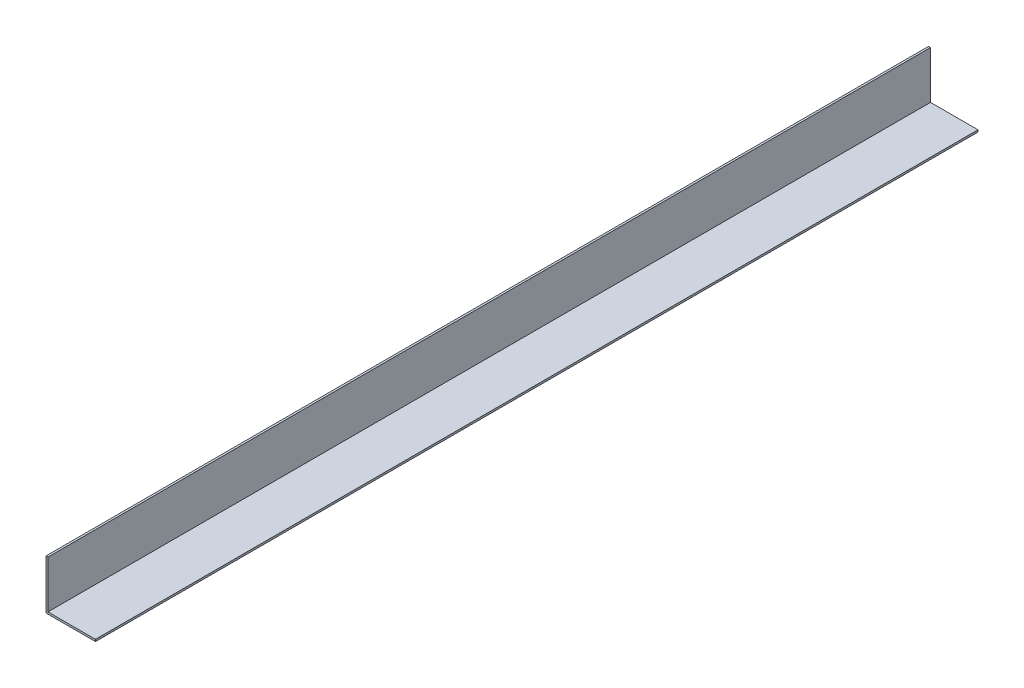
ISO-10303-21;
HEADER;
FILE_DESCRIPTION(('STEP AP214'),'2;1');
FILE_NAME('part.step','',(''),(''),'','','');
FILE_SCHEMA(('AUTOMOTIVE_DESIGN { 1 0 10303 214 1 1 1 1 }'));
ENDSEC;
DATA;
#1=APPLICATION_CONTEXT('core data for automotive mechanical design processes');
#2=APPLICATION_PROTOCOL_DEFINITION('international standard','automotive_design',2000,#1);
#3=PRODUCT_CONTEXT('',#1,'mechanical');
#4=PRODUCT('Part','Part','',(#3));
#5=PRODUCT_RELATED_PRODUCT_CATEGORY('part','',(#4));
#6=PRODUCT_DEFINITION_FORMATION('','',#4);
#7=PRODUCT_DEFINITION_CONTEXT('part definition',#1,'design');
#8=PRODUCT_DEFINITION('design','',#6,#7);
#9=PRODUCT_DEFINITION_SHAPE('','',#8);
#10=(LENGTH_UNIT() NAMED_UNIT(*) SI_UNIT(.MILLI.,.METRE.));
#11=(NAMED_UNIT(*) PLANE_ANGLE_UNIT() SI_UNIT($,.RADIAN.));
#12=(NAMED_UNIT(*) SI_UNIT($,.STERADIAN.) SOLID_ANGLE_UNIT());
#13=UNCERTAINTY_MEASURE_WITH_UNIT(LENGTH_MEASURE(1.E-05),#10,'distance_accuracy_value','');
#14=(GEOMETRIC_REPRESENTATION_CONTEXT(3) GLOBAL_UNCERTAINTY_ASSIGNED_CONTEXT((#13)) GLOBAL_UNIT_ASSIGNED_CONTEXT((#10,
#11,#12)) REPRESENTATION_CONTEXT('',''));
#15=CARTESIAN_POINT('',(0.,0.,0.));
#16=DIRECTION('',(0.,0.,1.));
#17=DIRECTION('',(1.,0.,0.));
#18=AXIS2_PLACEMENT_3D('',#15,#16,#17);
#19=CARTESIAN_POINT('',(1.19999999999999,30.,267.5));
#20=DIRECTION('',(0.,-1.,0.));
#21=DIRECTION('',(0.,0.,-1.));
#22=AXIS2_PLACEMENT_3D('',#19,#20,#21);
#23=PLANE('',#22);
#24=DIRECTION('',(-1.,0.,0.));
#25=VECTOR('',#24,1.);
#26=CARTESIAN_POINT('',(1.19999999999999,30.,-267.5));
#27=LINE('',#26,#25);
#28=CARTESIAN_POINT('',(1.19999999999999,30.,-267.5));
#29=VERTEX_POINT('',#28);
#30=CARTESIAN_POINT('',(0.,30.,-267.5));
#31=VERTEX_POINT('',#30);
#32=EDGE_CURVE('E121',#29,#31,#27,.T.);
#33=ORIENTED_EDGE('',*,*,#32,.T.);
#34=DIRECTION('',(0.,0.,-1.));
#35=VECTOR('',#34,1.);
#36=CARTESIAN_POINT('',(0.,30.,267.5));
#37=LINE('',#36,#35);
#38=CARTESIAN_POINT('',(0.,30.,267.5));
#39=VERTEX_POINT('',#38);
#40=EDGE_CURVE('E11',#39,#31,#37,.T.);
#41=ORIENTED_EDGE('',*,*,#40,.F.);
#42=DIRECTION('',(-1.,0.,0.));
#43=VECTOR('',#42,1.);
#44=CARTESIAN_POINT('',(1.19999999999999,30.,267.5));
#45=LINE('',#44,#43);
#46=CARTESIAN_POINT('',(1.19999999999999,30.,267.5));
#47=VERTEX_POINT('',#46);
#48=EDGE_CURVE('E131',#47,#39,#45,.T.);
#49=ORIENTED_EDGE('',*,*,#48,.F.);
#50=DIRECTION('',(0.,0.,-1.));
#51=VECTOR('',#50,1.);
#52=CARTESIAN_POINT('',(1.19999999999999,30.,267.5));
#53=LINE('',#52,#51);
#54=EDGE_CURVE('E117',#47,#29,#53,.T.);
#55=ORIENTED_EDGE('',*,*,#54,.T.);
#56=EDGE_LOOP('',(#33,#41,#49,#55));
#57=FACE_BOUND('',#56,.T.);
#58=ADVANCED_FACE('F37',(#57),#23,.F.);
#59=CARTESIAN_POINT('',(0.,30.,267.5));
#60=DIRECTION('',(1.,0.,0.));
#61=DIRECTION('',(0.,0.,-1.));
#62=AXIS2_PLACEMENT_3D('',#59,#60,#61);
#63=PLANE('',#62);
#64=DIRECTION('',(0.,-1.,0.));
#65=VECTOR('',#64,1.);
#66=CARTESIAN_POINT('',(0.,30.,-267.5));
#67=LINE('',#66,#65);
#68=CARTESIAN_POINT('',(0.,0.,-267.5));
#69=VERTEX_POINT('',#68);
#70=EDGE_CURVE('E124',#31,#69,#67,.T.);
#71=ORIENTED_EDGE('',*,*,#70,.T.);
#72=DIRECTION('',(0.,0.,-1.));
#73=VECTOR('',#72,1.);
#74=CARTESIAN_POINT('',(0.,0.,267.5));
#75=LINE('',#74,#73);
#76=CARTESIAN_POINT('',(0.,0.,267.5));
#77=VERTEX_POINT('',#76);
#78=EDGE_CURVE('E45',#77,#69,#75,.T.);
#79=ORIENTED_EDGE('',*,*,#78,.F.);
#80=DIRECTION('',(0.,-1.,0.));
#81=VECTOR('',#80,1.);
#82=CARTESIAN_POINT('',(0.,30.,267.5));
#83=LINE('',#82,#81);
#84=EDGE_CURVE('E90',#39,#77,#83,.T.);
#85=ORIENTED_EDGE('',*,*,#84,.F.);
#86=ORIENTED_EDGE('',*,*,#40,.T.);
#87=EDGE_LOOP('',(#71,#79,#85,#86));
#88=FACE_BOUND('',#87,.T.);
#89=ADVANCED_FACE('F155',(#88),#63,.F.);
#90=CARTESIAN_POINT('',(0.,0.,267.5));
#91=DIRECTION('',(0.,1.,0.));
#92=DIRECTION('',(0.,0.,1.));
#93=AXIS2_PLACEMENT_3D('',#90,#91,#92);
#94=PLANE('',#93);
#95=DIRECTION('',(1.,0.,0.));
#96=VECTOR('',#95,1.);
#97=CARTESIAN_POINT('',(0.,0.,-267.5));
#98=LINE('',#97,#96);
#99=CARTESIAN_POINT('',(30.,0.,-267.5));
#100=VERTEX_POINT('',#99);
#101=EDGE_CURVE('E126',#69,#100,#98,.T.);
#102=ORIENTED_EDGE('',*,*,#101,.T.);
#103=DIRECTION('',(0.,0.,-1.));
#104=VECTOR('',#103,1.);
#105=CARTESIAN_POINT('',(30.,0.,267.5));
#106=LINE('',#105,#104);
#107=CARTESIAN_POINT('',(30.,0.,267.5));
#108=VERTEX_POINT('',#107);
#109=EDGE_CURVE('E112',#108,#100,#106,.T.);
#110=ORIENTED_EDGE('',*,*,#109,.F.);
#111=DIRECTION('',(1.,0.,0.));
#112=VECTOR('',#111,1.);
#113=CARTESIAN_POINT('',(0.,0.,267.5));
#114=LINE('',#113,#112);
#115=EDGE_CURVE('E103',#77,#108,#114,.T.);
#116=ORIENTED_EDGE('',*,*,#115,.F.);
#117=ORIENTED_EDGE('',*,*,#78,.T.);
#118=EDGE_LOOP('',(#102,#110,#116,#117));
#119=FACE_BOUND('',#118,.T.);
#120=ADVANCED_FACE('F137',(#119),#94,.F.);
#121=CARTESIAN_POINT('',(30.,0.,267.5));
#122=DIRECTION('',(-1.,0.,0.));
#123=DIRECTION('',(0.,0.,1.));
#124=AXIS2_PLACEMENT_3D('',#121,#122,#123);
#125=PLANE('',#124);
#126=DIRECTION('',(0.,1.,0.));
#127=VECTOR('',#126,1.);
#128=CARTESIAN_POINT('',(30.,0.,-267.5));
#129=LINE('',#128,#127);
#130=CARTESIAN_POINT('',(30.,1.2,-267.5));
#131=VERTEX_POINT('',#130);
#132=EDGE_CURVE('E111',#100,#131,#129,.T.);
#133=ORIENTED_EDGE('',*,*,#132,.T.);
#134=DIRECTION('',(0.,0.,-1.));
#135=VECTOR('',#134,1.);
#136=CARTESIAN_POINT('',(30.,1.2,267.5));
#137=LINE('',#136,#135);
#138=CARTESIAN_POINT('',(30.,1.2,267.5));
#139=VERTEX_POINT('',#138);
#140=EDGE_CURVE('E108',#139,#131,#137,.T.);
#141=ORIENTED_EDGE('',*,*,#140,.F.);
#142=DIRECTION('',(0.,1.,0.));
#143=VECTOR('',#142,1.);
#144=CARTESIAN_POINT('',(30.,0.,267.5));
#145=LINE('',#144,#143);
#146=EDGE_CURVE('E97',#108,#139,#145,.T.);
#147=ORIENTED_EDGE('',*,*,#146,.F.);
#148=ORIENTED_EDGE('',*,*,#109,.T.);
#149=EDGE_LOOP('',(#133,#141,#147,#148));
#150=FACE_BOUND('',#149,.T.);
#151=ADVANCED_FACE('F109',(#150),#125,.F.);
#152=CARTESIAN_POINT('',(30.,1.2,267.5));
#153=DIRECTION('',(0.,-1.,0.));
#154=DIRECTION('',(1.,0.,0.));
#155=AXIS2_PLACEMENT_3D('',#152,#153,#154);
#156=PLANE('',#155);
#157=DIRECTION('',(-1.,0.,0.));
#158=VECTOR('',#157,1.);
#159=CARTESIAN_POINT('',(30.,1.2,-267.5));
#160=LINE('',#159,#158);
#161=CARTESIAN_POINT('',(1.19999999999999,1.2,-267.5));
#162=VERTEX_POINT('',#161);
#163=EDGE_CURVE('E76',#131,#162,#160,.T.);
#164=ORIENTED_EDGE('',*,*,#163,.T.);
#165=DIRECTION('',(0.,0.,-1.));
#166=VECTOR('',#165,1.);
#167=CARTESIAN_POINT('',(1.19999999999999,1.2,267.5));
#168=LINE('',#167,#166);
#169=CARTESIAN_POINT('',(1.19999999999999,1.2,267.5));
#170=VERTEX_POINT('',#169);
#171=EDGE_CURVE('E113',#170,#162,#168,.T.);
#172=ORIENTED_EDGE('',*,*,#171,.F.);
#173=DIRECTION('',(-1.,0.,0.));
#174=VECTOR('',#173,1.);
#175=CARTESIAN_POINT('',(30.,1.2,267.5));
#176=LINE('',#175,#174);
#177=EDGE_CURVE('E101',#139,#170,#176,.T.);
#178=ORIENTED_EDGE('',*,*,#177,.F.);
#179=ORIENTED_EDGE('',*,*,#140,.T.);
#180=EDGE_LOOP('',(#164,#172,#178,#179));
#181=FACE_BOUND('',#180,.T.);
#182=ADVANCED_FACE('F115',(#181),#156,.F.);
#183=CARTESIAN_POINT('',(1.19999999999999,1.2,267.5));
#184=DIRECTION('',(-1.,0.,0.));
#185=DIRECTION('',(0.,0.,1.));
#186=AXIS2_PLACEMENT_3D('',#183,#184,#185);
#187=PLANE('',#186);
#188=DIRECTION('',(0.,1.,0.));
#189=VECTOR('',#188,1.);
#190=CARTESIAN_POINT('',(1.19999999999999,1.2,-267.5));
#191=LINE('',#190,#189);
#192=EDGE_CURVE('E82',#162,#29,#191,.T.);
#193=ORIENTED_EDGE('',*,*,#192,.T.);
#194=ORIENTED_EDGE('',*,*,#54,.F.);
#195=DIRECTION('',(0.,1.,0.));
#196=VECTOR('',#195,1.);
#197=CARTESIAN_POINT('',(1.19999999999999,1.2,267.5));
#198=LINE('',#197,#196);
#199=EDGE_CURVE('E53',#170,#47,#198,.T.);
#200=ORIENTED_EDGE('',*,*,#199,.F.);
#201=ORIENTED_EDGE('',*,*,#171,.T.);
#202=EDGE_LOOP('',(#193,#194,#200,#201));
#203=FACE_BOUND('',#202,.T.);
#204=ADVANCED_FACE('F144',(#203),#187,.F.);
#205=CARTESIAN_POINT('',(0.,0.,267.5));
#206=DIRECTION('',(0.,0.,1.));
#207=DIRECTION('',(1.,0.,0.));
#208=AXIS2_PLACEMENT_3D('',#205,#206,#207);
#209=PLANE('',#208);
#210=ORIENTED_EDGE('',*,*,#48,.T.);
#211=ORIENTED_EDGE('',*,*,#84,.T.);
#212=ORIENTED_EDGE('',*,*,#115,.T.);
#213=ORIENTED_EDGE('',*,*,#146,.T.);
#214=ORIENTED_EDGE('',*,*,#177,.T.);
#215=ORIENTED_EDGE('',*,*,#199,.T.);
#216=EDGE_LOOP('',(#210,#211,#212,#213,#214,#215));
#217=FACE_BOUND('',#216,.T.);
#218=ADVANCED_FACE('F99',(#217),#209,.T.);
#219=CARTESIAN_POINT('',(0.,0.,-267.5));
#220=DIRECTION('',(0.,0.,1.));
#221=DIRECTION('',(1.,0.,0.));
#222=AXIS2_PLACEMENT_3D('',#219,#220,#221);
#223=PLANE('',#222);
#224=ORIENTED_EDGE('',*,*,#32,.F.);
#225=ORIENTED_EDGE('',*,*,#192,.F.);
#226=ORIENTED_EDGE('',*,*,#163,.F.);
#227=ORIENTED_EDGE('',*,*,#132,.F.);
#228=ORIENTED_EDGE('',*,*,#101,.F.);
#229=ORIENTED_EDGE('',*,*,#70,.F.);
#230=EDGE_LOOP('',(#224,#225,#226,#227,#228,#229));
#231=FACE_BOUND('',#230,.T.);
#232=ADVANCED_FACE('F140',(#231),#223,.F.);
#233=CLOSED_SHELL('',(#58,#89,#120,#151,#182,#204,#218,#232));
#234=MANIFOLD_SOLID_BREP('B2',#233);
#235=ADVANCED_BREP_SHAPE_REPRESENTATION('',(#18,#234),#14);
#236=SHAPE_DEFINITION_REPRESENTATION(#9,#235);
ENDSEC;
END-ISO-10303-21;
